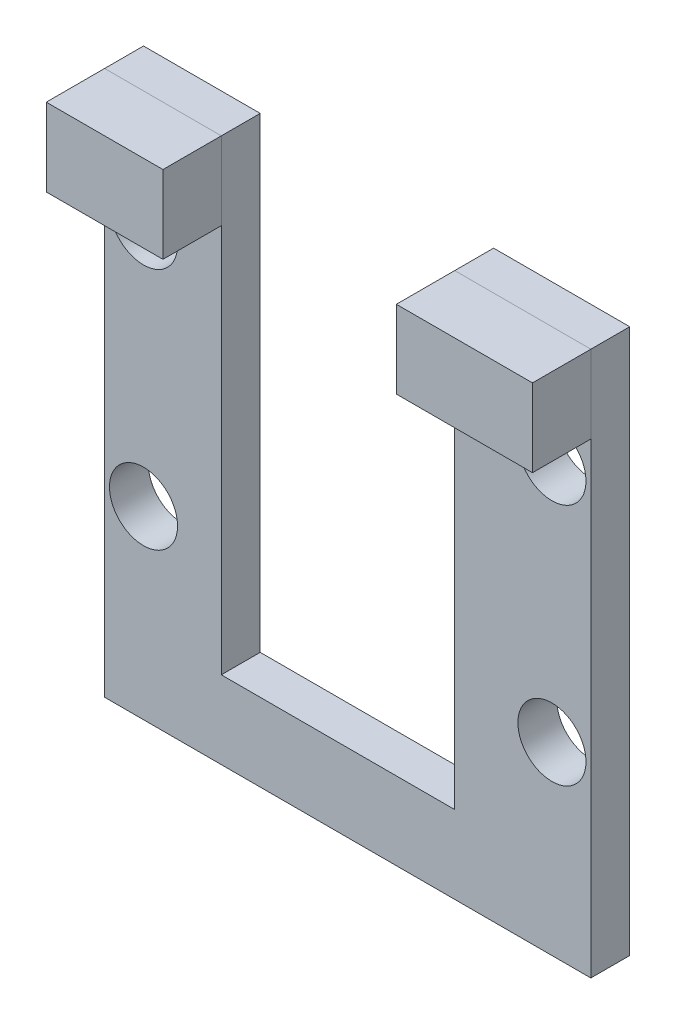
ISO-10303-21;
HEADER;
FILE_DESCRIPTION(('STEP AP214'),'2;1');
FILE_NAME('part.step','',(''),(''),'','','');
FILE_SCHEMA(('AUTOMOTIVE_DESIGN { 1 0 10303 214 1 1 1 1 }'));
ENDSEC;
DATA;
#1=APPLICATION_CONTEXT('core data for automotive mechanical design processes');
#2=APPLICATION_PROTOCOL_DEFINITION('international standard','automotive_design',2000,#1);
#3=PRODUCT_CONTEXT('',#1,'mechanical');
#4=PRODUCT('Part','Part','',(#3));
#5=PRODUCT_RELATED_PRODUCT_CATEGORY('part','',(#4));
#6=PRODUCT_DEFINITION_FORMATION('','',#4);
#7=PRODUCT_DEFINITION_CONTEXT('part definition',#1,'design');
#8=PRODUCT_DEFINITION('design','',#6,#7);
#9=PRODUCT_DEFINITION_SHAPE('','',#8);
#10=(LENGTH_UNIT() NAMED_UNIT(*) SI_UNIT(.MILLI.,.METRE.));
#11=(NAMED_UNIT(*) PLANE_ANGLE_UNIT() SI_UNIT($,.RADIAN.));
#12=(NAMED_UNIT(*) SI_UNIT($,.STERADIAN.) SOLID_ANGLE_UNIT());
#13=UNCERTAINTY_MEASURE_WITH_UNIT(LENGTH_MEASURE(1.E-05),#10,'distance_accuracy_value','');
#14=(GEOMETRIC_REPRESENTATION_CONTEXT(3) GLOBAL_UNCERTAINTY_ASSIGNED_CONTEXT((#13)) GLOBAL_UNIT_ASSIGNED_CONTEXT((#10,
#11,#12)) REPRESENTATION_CONTEXT('',''));
#15=CARTESIAN_POINT('',(0.,0.,0.));
#16=DIRECTION('',(0.,0.,1.));
#17=DIRECTION('',(1.,0.,0.));
#18=AXIS2_PLACEMENT_3D('',#15,#16,#17);
#19=CARTESIAN_POINT('',(-19.1048228841698,16.1443272647558,33.));
#20=DIRECTION('',(1.,0.,0.));
#21=DIRECTION('',(0.,0.,-1.));
#22=AXIS2_PLACEMENT_3D('',#19,#20,#21);
#23=PLANE('',#22);
#24=DIRECTION('',(0.,-1.,0.));
#25=VECTOR('',#24,1.);
#26=CARTESIAN_POINT('',(-19.1048228841698,16.1443272647558,30.));
#27=LINE('',#26,#25);
#28=CARTESIAN_POINT('',(-19.1048228841698,20.1443272647558,30.));
#29=VERTEX_POINT('',#28);
#30=CARTESIAN_POINT('',(-19.1048228841698,16.1443272647558,30.));
#31=VERTEX_POINT('',#30);
#32=EDGE_CURVE('P0_E79',#29,#31,#27,.T.);
#33=ORIENTED_EDGE('',*,*,#32,.T.);
#34=DIRECTION('',(0.,0.,-1.));
#35=VECTOR('',#34,1.);
#36=CARTESIAN_POINT('',(-19.1048228841698,16.1443272647558,33.));
#37=LINE('',#36,#35);
#38=CARTESIAN_POINT('',(-19.1048228841698,16.1443272647558,33.));
#39=VERTEX_POINT('',#38);
#40=EDGE_CURVE('P0_E10',#39,#31,#37,.T.);
#41=ORIENTED_EDGE('',*,*,#40,.F.);
#42=DIRECTION('',(0.,-1.,0.));
#43=VECTOR('',#42,1.);
#44=CARTESIAN_POINT('',(-19.1048228841698,16.1443272647558,33.));
#45=LINE('',#44,#43);
#46=CARTESIAN_POINT('',(-19.1048228841698,20.1443272647558,33.));
#47=VERTEX_POINT('',#46);
#48=EDGE_CURVE('P0_E67',#47,#39,#45,.T.);
#49=ORIENTED_EDGE('',*,*,#48,.F.);
#50=DIRECTION('',(0.,0.,-1.));
#51=VECTOR('',#50,1.);
#52=CARTESIAN_POINT('',(-19.1048228841698,20.1443272647558,33.));
#53=LINE('',#52,#51);
#54=EDGE_CURVE('P0_E75',#47,#29,#53,.T.);
#55=ORIENTED_EDGE('',*,*,#54,.T.);
#56=EDGE_LOOP('',(#33,#41,#49,#55));
#57=FACE_BOUND('',#56,.T.);
#58=ADVANCED_FACE('P0_F16',(#57),#23,.F.);
#59=CARTESIAN_POINT('',(-19.1048228841698,16.1443272647558,33.));
#60=DIRECTION('',(0.,1.,0.));
#61=DIRECTION('',(0.,0.,1.));
#62=AXIS2_PLACEMENT_3D('',#59,#60,#61);
#63=PLANE('',#62);
#64=DIRECTION('',(1.,0.,0.));
#65=VECTOR('',#64,1.);
#66=CARTESIAN_POINT('',(-19.1048228841698,16.1443272647558,30.));
#67=LINE('',#66,#65);
#68=CARTESIAN_POINT('',(-13.1048228841698,16.1443272647558,30.));
#69=VERTEX_POINT('',#68);
#70=EDGE_CURVE('P0_E71',#31,#69,#67,.T.);
#71=ORIENTED_EDGE('',*,*,#70,.T.);
#72=DIRECTION('',(0.,0.,-1.));
#73=VECTOR('',#72,1.);
#74=CARTESIAN_POINT('',(-13.1048228841698,16.1443272647558,33.));
#75=LINE('',#74,#73);
#76=CARTESIAN_POINT('',(-13.1048228841698,16.1443272647558,33.));
#77=VERTEX_POINT('',#76);
#78=EDGE_CURVE('P0_E24',#77,#69,#75,.T.);
#79=ORIENTED_EDGE('',*,*,#78,.F.);
#80=DIRECTION('',(1.,0.,0.));
#81=VECTOR('',#80,1.);
#82=CARTESIAN_POINT('',(-19.1048228841698,16.1443272647558,33.));
#83=LINE('',#82,#81);
#84=EDGE_CURVE('P0_E62',#39,#77,#83,.T.);
#85=ORIENTED_EDGE('',*,*,#84,.F.);
#86=ORIENTED_EDGE('',*,*,#40,.T.);
#87=EDGE_LOOP('',(#71,#79,#85,#86));
#88=FACE_BOUND('',#87,.T.);
#89=ADVANCED_FACE('P0_F70',(#88),#63,.F.);
#90=CARTESIAN_POINT('',(-13.1048228841698,16.1443272647558,33.));
#91=DIRECTION('',(-1.,0.,0.));
#92=DIRECTION('',(0.,0.,1.));
#93=AXIS2_PLACEMENT_3D('',#90,#91,#92);
#94=PLANE('',#93);
#95=DIRECTION('',(0.,1.,0.));
#96=VECTOR('',#95,1.);
#97=CARTESIAN_POINT('',(-13.1048228841698,16.1443272647558,30.));
#98=LINE('',#97,#96);
#99=CARTESIAN_POINT('',(-13.1048228841698,20.1443272647558,30.));
#100=VERTEX_POINT('',#99);
#101=EDGE_CURVE('P0_E49',#69,#100,#98,.T.);
#102=ORIENTED_EDGE('',*,*,#101,.T.);
#103=DIRECTION('',(0.,0.,-1.));
#104=VECTOR('',#103,1.);
#105=CARTESIAN_POINT('',(-13.1048228841698,20.1443272647558,33.));
#106=LINE('',#105,#104);
#107=CARTESIAN_POINT('',(-13.1048228841698,20.1443272647558,33.));
#108=VERTEX_POINT('',#107);
#109=EDGE_CURVE('P0_E72',#108,#100,#106,.T.);
#110=ORIENTED_EDGE('',*,*,#109,.F.);
#111=DIRECTION('',(0.,1.,0.));
#112=VECTOR('',#111,1.);
#113=CARTESIAN_POINT('',(-13.1048228841698,16.1443272647558,33.));
#114=LINE('',#113,#112);
#115=EDGE_CURVE('P0_E65',#77,#108,#114,.T.);
#116=ORIENTED_EDGE('',*,*,#115,.F.);
#117=ORIENTED_EDGE('',*,*,#78,.T.);
#118=EDGE_LOOP('',(#102,#110,#116,#117));
#119=FACE_BOUND('',#118,.T.);
#120=ADVANCED_FACE('P0_F73',(#119),#94,.F.);
#121=CARTESIAN_POINT('',(-19.1048228841698,20.1443272647558,33.));
#122=DIRECTION('',(0.,-1.,0.));
#123=DIRECTION('',(0.,0.,-1.));
#124=AXIS2_PLACEMENT_3D('',#121,#122,#123);
#125=PLANE('',#124);
#126=DIRECTION('',(-1.,0.,0.));
#127=VECTOR('',#126,1.);
#128=CARTESIAN_POINT('',(-19.1048228841698,20.1443272647558,30.));
#129=LINE('',#128,#127);
#130=EDGE_CURVE('P0_E55',#100,#29,#129,.T.);
#131=ORIENTED_EDGE('',*,*,#130,.T.);
#132=ORIENTED_EDGE('',*,*,#54,.F.);
#133=DIRECTION('',(-1.,0.,0.));
#134=VECTOR('',#133,1.);
#135=CARTESIAN_POINT('',(-19.1048228841698,20.1443272647558,33.));
#136=LINE('',#135,#134);
#137=EDGE_CURVE('P0_E32',#108,#47,#136,.T.);
#138=ORIENTED_EDGE('',*,*,#137,.F.);
#139=ORIENTED_EDGE('',*,*,#109,.T.);
#140=EDGE_LOOP('',(#131,#132,#138,#139));
#141=FACE_BOUND('',#140,.T.);
#142=ADVANCED_FACE('P0_F86',(#141),#125,.F.);
#143=CARTESIAN_POINT('',(-19.1048228841698,16.1443272647558,33.));
#144=DIRECTION('',(0.,0.,-1.));
#145=DIRECTION('',(-1.,0.,0.));
#146=AXIS2_PLACEMENT_3D('',#143,#144,#145);
#147=PLANE('',#146);
#148=ORIENTED_EDGE('',*,*,#48,.T.);
#149=ORIENTED_EDGE('',*,*,#84,.T.);
#150=ORIENTED_EDGE('',*,*,#115,.T.);
#151=ORIENTED_EDGE('',*,*,#137,.T.);
#152=EDGE_LOOP('',(#148,#149,#150,#151));
#153=FACE_BOUND('',#152,.T.);
#154=ADVANCED_FACE('P0_F63',(#153),#147,.F.);
#155=CARTESIAN_POINT('',(-19.1048228841698,16.1443272647558,30.));
#156=DIRECTION('',(0.,0.,-1.));
#157=DIRECTION('',(-1.,0.,0.));
#158=AXIS2_PLACEMENT_3D('',#155,#156,#157);
#159=PLANE('',#158);
#160=ORIENTED_EDGE('',*,*,#32,.F.);
#161=ORIENTED_EDGE('',*,*,#130,.F.);
#162=ORIENTED_EDGE('',*,*,#101,.F.);
#163=ORIENTED_EDGE('',*,*,#70,.F.);
#164=EDGE_LOOP('',(#160,#161,#162,#163));
#165=FACE_BOUND('',#164,.T.);
#166=ADVANCED_FACE('P0_F89',(#165),#159,.T.);
#167=CLOSED_SHELL('',(#58,#89,#120,#142,#154,#166));
#168=MANIFOLD_SOLID_BREP('P0_B1',#167);
#169=CARTESIAN_POINT('',(-1.10482288416981,16.1443272647558,33.));
#170=DIRECTION('',(1.,0.,0.));
#171=DIRECTION('',(0.,0.,-1.));
#172=AXIS2_PLACEMENT_3D('',#169,#170,#171);
#173=PLANE('',#172);
#174=DIRECTION('',(0.,-1.,0.));
#175=VECTOR('',#174,1.);
#176=CARTESIAN_POINT('',(-1.10482288416981,16.1443272647558,30.));
#177=LINE('',#176,#175);
#178=CARTESIAN_POINT('',(-1.10482288416981,20.1443272647558,30.));
#179=VERTEX_POINT('',#178);
#180=CARTESIAN_POINT('',(-1.10482288416981,16.1443272647558,30.));
#181=VERTEX_POINT('',#180);
#182=EDGE_CURVE('P1_E80',#179,#181,#177,.T.);
#183=ORIENTED_EDGE('',*,*,#182,.T.);
#184=DIRECTION('',(0.,0.,-1.));
#185=VECTOR('',#184,1.);
#186=CARTESIAN_POINT('',(-1.10482288416981,16.1443272647558,33.));
#187=LINE('',#186,#185);
#188=CARTESIAN_POINT('',(-1.10482288416981,16.1443272647558,33.));
#189=VERTEX_POINT('',#188);
#190=EDGE_CURVE('P1_E11',#189,#181,#187,.T.);
#191=ORIENTED_EDGE('',*,*,#190,.F.);
#192=DIRECTION('',(0.,-1.,0.));
#193=VECTOR('',#192,1.);
#194=CARTESIAN_POINT('',(-1.10482288416981,16.1443272647558,33.));
#195=LINE('',#194,#193);
#196=CARTESIAN_POINT('',(-1.10482288416981,20.1443272647558,33.));
#197=VERTEX_POINT('',#196);
#198=EDGE_CURVE('P1_E68',#197,#189,#195,.T.);
#199=ORIENTED_EDGE('',*,*,#198,.F.);
#200=DIRECTION('',(0.,0.,-1.));
#201=VECTOR('',#200,1.);
#202=CARTESIAN_POINT('',(-1.10482288416981,20.1443272647558,33.));
#203=LINE('',#202,#201);
#204=EDGE_CURVE('P1_E76',#197,#179,#203,.T.);
#205=ORIENTED_EDGE('',*,*,#204,.T.);
#206=EDGE_LOOP('',(#183,#191,#199,#205));
#207=FACE_BOUND('',#206,.T.);
#208=ADVANCED_FACE('P1_F17',(#207),#173,.F.);
#209=CARTESIAN_POINT('',(-1.10482288416981,16.1443272647558,33.));
#210=DIRECTION('',(0.,1.,0.));
#211=DIRECTION('',(0.,0.,1.));
#212=AXIS2_PLACEMENT_3D('',#209,#210,#211);
#213=PLANE('',#212);
#214=DIRECTION('',(1.,0.,0.));
#215=VECTOR('',#214,1.);
#216=CARTESIAN_POINT('',(-1.10482288416981,16.1443272647558,30.));
#217=LINE('',#216,#215);
#218=CARTESIAN_POINT('',(5.89517711583019,16.1443272647558,30.));
#219=VERTEX_POINT('',#218);
#220=EDGE_CURVE('P1_E72',#181,#219,#217,.T.);
#221=ORIENTED_EDGE('',*,*,#220,.T.);
#222=DIRECTION('',(0.,0.,-1.));
#223=VECTOR('',#222,1.);
#224=CARTESIAN_POINT('',(5.89517711583019,16.1443272647558,33.));
#225=LINE('',#224,#223);
#226=CARTESIAN_POINT('',(5.89517711583019,16.1443272647558,33.));
#227=VERTEX_POINT('',#226);
#228=EDGE_CURVE('P1_E25',#227,#219,#225,.T.);
#229=ORIENTED_EDGE('',*,*,#228,.F.);
#230=DIRECTION('',(1.,0.,0.));
#231=VECTOR('',#230,1.);
#232=CARTESIAN_POINT('',(-1.10482288416981,16.1443272647558,33.));
#233=LINE('',#232,#231);
#234=EDGE_CURVE('P1_E63',#189,#227,#233,.T.);
#235=ORIENTED_EDGE('',*,*,#234,.F.);
#236=ORIENTED_EDGE('',*,*,#190,.T.);
#237=EDGE_LOOP('',(#221,#229,#235,#236));
#238=FACE_BOUND('',#237,.T.);
#239=ADVANCED_FACE('P1_F71',(#238),#213,.F.);
#240=CARTESIAN_POINT('',(5.89517711583019,16.1443272647558,33.));
#241=DIRECTION('',(-1.,0.,0.));
#242=DIRECTION('',(0.,0.,1.));
#243=AXIS2_PLACEMENT_3D('',#240,#241,#242);
#244=PLANE('',#243);
#245=DIRECTION('',(0.,1.,0.));
#246=VECTOR('',#245,1.);
#247=CARTESIAN_POINT('',(5.89517711583019,16.1443272647558,30.));
#248=LINE('',#247,#246);
#249=CARTESIAN_POINT('',(5.89517711583019,20.1443272647558,30.));
#250=VERTEX_POINT('',#249);
#251=EDGE_CURVE('P1_E50',#219,#250,#248,.T.);
#252=ORIENTED_EDGE('',*,*,#251,.T.);
#253=DIRECTION('',(0.,0.,-1.));
#254=VECTOR('',#253,1.);
#255=CARTESIAN_POINT('',(5.89517711583019,20.1443272647558,33.));
#256=LINE('',#255,#254);
#257=CARTESIAN_POINT('',(5.89517711583019,20.1443272647558,33.));
#258=VERTEX_POINT('',#257);
#259=EDGE_CURVE('P1_E73',#258,#250,#256,.T.);
#260=ORIENTED_EDGE('',*,*,#259,.F.);
#261=DIRECTION('',(0.,1.,0.));
#262=VECTOR('',#261,1.);
#263=CARTESIAN_POINT('',(5.89517711583019,16.1443272647558,33.));
#264=LINE('',#263,#262);
#265=EDGE_CURVE('P1_E66',#227,#258,#264,.T.);
#266=ORIENTED_EDGE('',*,*,#265,.F.);
#267=ORIENTED_EDGE('',*,*,#228,.T.);
#268=EDGE_LOOP('',(#252,#260,#266,#267));
#269=FACE_BOUND('',#268,.T.);
#270=ADVANCED_FACE('P1_F74',(#269),#244,.F.);
#271=CARTESIAN_POINT('',(-1.10482288416981,20.1443272647558,33.));
#272=DIRECTION('',(0.,-1.,0.));
#273=DIRECTION('',(0.,0.,-1.));
#274=AXIS2_PLACEMENT_3D('',#271,#272,#273);
#275=PLANE('',#274);
#276=DIRECTION('',(-1.,0.,0.));
#277=VECTOR('',#276,1.);
#278=CARTESIAN_POINT('',(-1.10482288416981,20.1443272647558,30.));
#279=LINE('',#278,#277);
#280=EDGE_CURVE('P1_E56',#250,#179,#279,.T.);
#281=ORIENTED_EDGE('',*,*,#280,.T.);
#282=ORIENTED_EDGE('',*,*,#204,.F.);
#283=DIRECTION('',(-1.,0.,0.));
#284=VECTOR('',#283,1.);
#285=CARTESIAN_POINT('',(-1.10482288416981,20.1443272647558,33.));
#286=LINE('',#285,#284);
#287=EDGE_CURVE('P1_E33',#258,#197,#286,.T.);
#288=ORIENTED_EDGE('',*,*,#287,.F.);
#289=ORIENTED_EDGE('',*,*,#259,.T.);
#290=EDGE_LOOP('',(#281,#282,#288,#289));
#291=FACE_BOUND('',#290,.T.);
#292=ADVANCED_FACE('P1_F87',(#291),#275,.F.);
#293=CARTESIAN_POINT('',(-1.10482288416981,16.1443272647558,33.));
#294=DIRECTION('',(0.,0.,-1.));
#295=DIRECTION('',(-1.,0.,0.));
#296=AXIS2_PLACEMENT_3D('',#293,#294,#295);
#297=PLANE('',#296);
#298=ORIENTED_EDGE('',*,*,#198,.T.);
#299=ORIENTED_EDGE('',*,*,#234,.T.);
#300=ORIENTED_EDGE('',*,*,#265,.T.);
#301=ORIENTED_EDGE('',*,*,#287,.T.);
#302=EDGE_LOOP('',(#298,#299,#300,#301));
#303=FACE_BOUND('',#302,.T.);
#304=ADVANCED_FACE('P1_F64',(#303),#297,.F.);
#305=CARTESIAN_POINT('',(-1.10482288416981,16.1443272647558,30.));
#306=DIRECTION('',(0.,0.,-1.));
#307=DIRECTION('',(-1.,0.,0.));
#308=AXIS2_PLACEMENT_3D('',#305,#306,#307);
#309=PLANE('',#308);
#310=ORIENTED_EDGE('',*,*,#182,.F.);
#311=ORIENTED_EDGE('',*,*,#280,.F.);
#312=ORIENTED_EDGE('',*,*,#251,.F.);
#313=ORIENTED_EDGE('',*,*,#220,.F.);
#314=EDGE_LOOP('',(#310,#311,#312,#313));
#315=FACE_BOUND('',#314,.T.);
#316=ADVANCED_FACE('P1_F90',(#315),#309,.T.);
#317=CLOSED_SHELL('',(#208,#239,#270,#292,#304,#316));
#318=MANIFOLD_SOLID_BREP('P1_B1',#317);
#319=CARTESIAN_POINT('',(5.8951771158302,-7.85567273524422,30.));
#320=DIRECTION('',(-1.,0.,0.));
#321=DIRECTION('',(0.,-1.,0.));
#322=AXIS2_PLACEMENT_3D('',#319,#320,#321);
#323=PLANE('',#322);
#324=DIRECTION('',(0.,1.,0.));
#325=VECTOR('',#324,1.);
#326=CARTESIAN_POINT('',(5.8951771158302,-7.85567273524422,28.));
#327=LINE('',#326,#325);
#328=CARTESIAN_POINT('',(5.8951771158302,-7.85567273524423,28.));
#329=VERTEX_POINT('',#328);
#330=CARTESIAN_POINT('',(5.8951771158302,20.1443272647558,28.));
#331=VERTEX_POINT('',#330);
#332=EDGE_CURVE('P2_E124',#329,#331,#327,.T.);
#333=ORIENTED_EDGE('',*,*,#332,.T.);
#334=DIRECTION('',(0.,0.,-1.));
#335=VECTOR('',#334,1.);
#336=CARTESIAN_POINT('',(5.8951771158302,20.1443272647558,30.));
#337=LINE('',#336,#335);
#338=CARTESIAN_POINT('',(5.8951771158302,20.1443272647558,30.));
#339=VERTEX_POINT('',#338);
#340=EDGE_CURVE('P2_E11',#339,#331,#337,.T.);
#341=ORIENTED_EDGE('',*,*,#340,.F.);
#342=DIRECTION('',(0.,1.,0.));
#343=VECTOR('',#342,1.);
#344=CARTESIAN_POINT('',(5.8951771158302,-7.85567273524422,30.));
#345=LINE('',#344,#343);
#346=CARTESIAN_POINT('',(5.8951771158302,-7.85567273524423,30.));
#347=VERTEX_POINT('',#346);
#348=EDGE_CURVE('P2_E70',#347,#339,#345,.T.);
#349=ORIENTED_EDGE('',*,*,#348,.F.);
#350=DIRECTION('',(0.,0.,-1.));
#351=VECTOR('',#350,1.);
#352=CARTESIAN_POINT('',(5.8951771158302,-7.85567273524423,30.));
#353=LINE('',#352,#351);
#354=EDGE_CURVE('P2_E108',#347,#329,#353,.T.);
#355=ORIENTED_EDGE('',*,*,#354,.T.);
#356=EDGE_LOOP('',(#333,#341,#349,#355));
#357=FACE_BOUND('',#356,.T.);
#358=ADVANCED_FACE('P2_F17',(#357),#323,.F.);
#359=CARTESIAN_POINT('',(-19.1048228841698,20.1443272647558,30.));
#360=DIRECTION('',(0.,1.,0.));
#361=DIRECTION('',(0.,0.,1.));
#362=AXIS2_PLACEMENT_3D('',#359,#360,#361);
#363=PLANE('',#362);
#364=DIRECTION('',(1.,0.,0.));
#365=VECTOR('',#364,1.);
#366=CARTESIAN_POINT('',(-19.1048228841698,20.1443272647558,28.));
#367=LINE('',#366,#365);
#368=CARTESIAN_POINT('',(-1.1048228841698,20.1443272647558,28.));
#369=VERTEX_POINT('',#368);
#370=EDGE_CURVE('P2_E127',#369,#331,#367,.T.);
#371=ORIENTED_EDGE('',*,*,#370,.F.);
#372=DIRECTION('',(0.,0.,-1.));
#373=VECTOR('',#372,1.);
#374=CARTESIAN_POINT('',(-1.1048228841698,20.1443272647558,30.));
#375=LINE('',#374,#373);
#376=CARTESIAN_POINT('',(-1.1048228841698,20.1443272647558,30.));
#377=VERTEX_POINT('',#376);
#378=EDGE_CURVE('P2_E26',#377,#369,#375,.T.);
#379=ORIENTED_EDGE('',*,*,#378,.F.);
#380=DIRECTION('',(1.,0.,0.));
#381=VECTOR('',#380,1.);
#382=CARTESIAN_POINT('',(-19.1048228841698,20.1443272647558,30.));
#383=LINE('',#382,#381);
#384=EDGE_CURVE('P2_E169',#377,#339,#383,.T.);
#385=ORIENTED_EDGE('',*,*,#384,.T.);
#386=ORIENTED_EDGE('',*,*,#340,.T.);
#387=EDGE_LOOP('',(#371,#379,#385,#386));
#388=FACE_BOUND('',#387,.T.);
#389=ADVANCED_FACE('P2_F159',(#388),#363,.T.);
#390=CARTESIAN_POINT('',(-1.1048228841698,-7.85567273524423,30.));
#391=DIRECTION('',(-1.,0.,0.));
#392=DIRECTION('',(0.,0.,1.));
#393=AXIS2_PLACEMENT_3D('',#390,#391,#392);
#394=PLANE('',#393);
#395=DIRECTION('',(0.,1.,0.));
#396=VECTOR('',#395,1.);
#397=CARTESIAN_POINT('',(-1.1048228841698,-7.85567273524423,28.));
#398=LINE('',#397,#396);
#399=CARTESIAN_POINT('',(-1.1048228841698,-3.85567273524423,28.));
#400=VERTEX_POINT('',#399);
#401=EDGE_CURVE('P2_E130',#400,#369,#398,.T.);
#402=ORIENTED_EDGE('',*,*,#401,.F.);
#403=DIRECTION('',(0.,0.,-1.));
#404=VECTOR('',#403,1.);
#405=CARTESIAN_POINT('',(-1.1048228841698,-3.85567273524423,30.));
#406=LINE('',#405,#404);
#407=CARTESIAN_POINT('',(-1.1048228841698,-3.85567273524423,30.));
#408=VERTEX_POINT('',#407);
#409=EDGE_CURVE('P2_E149',#408,#400,#406,.T.);
#410=ORIENTED_EDGE('',*,*,#409,.F.);
#411=DIRECTION('',(0.,1.,0.));
#412=VECTOR('',#411,1.);
#413=CARTESIAN_POINT('',(-1.1048228841698,-7.85567273524423,30.));
#414=LINE('',#413,#412);
#415=EDGE_CURVE('P2_E156',#408,#377,#414,.T.);
#416=ORIENTED_EDGE('',*,*,#415,.T.);
#417=ORIENTED_EDGE('',*,*,#378,.T.);
#418=EDGE_LOOP('',(#402,#410,#416,#417));
#419=FACE_BOUND('',#418,.T.);
#420=ADVANCED_FACE('P2_F154',(#419),#394,.T.);
#421=CARTESIAN_POINT('',(-19.1048228841698,-3.85567273524423,30.));
#422=DIRECTION('',(0.,1.,0.));
#423=DIRECTION('',(0.,0.,1.));
#424=AXIS2_PLACEMENT_3D('',#421,#422,#423);
#425=PLANE('',#424);
#426=DIRECTION('',(1.,0.,0.));
#427=VECTOR('',#426,1.);
#428=CARTESIAN_POINT('',(-19.1048228841698,-3.85567273524423,28.));
#429=LINE('',#428,#427);
#430=CARTESIAN_POINT('',(-13.1048228841698,-3.85567273524423,28.));
#431=VERTEX_POINT('',#430);
#432=EDGE_CURVE('P2_E133',#431,#400,#429,.T.);
#433=ORIENTED_EDGE('',*,*,#432,.F.);
#434=DIRECTION('',(0.,0.,-1.));
#435=VECTOR('',#434,1.);
#436=CARTESIAN_POINT('',(-13.1048228841698,-3.85567273524423,30.));
#437=LINE('',#436,#435);
#438=CARTESIAN_POINT('',(-13.1048228841698,-3.85567273524423,30.));
#439=VERTEX_POINT('',#438);
#440=EDGE_CURVE('P2_E147',#439,#431,#437,.T.);
#441=ORIENTED_EDGE('',*,*,#440,.F.);
#442=DIRECTION('',(1.,0.,0.));
#443=VECTOR('',#442,1.);
#444=CARTESIAN_POINT('',(-19.1048228841698,-3.85567273524423,30.));
#445=LINE('',#444,#443);
#446=EDGE_CURVE('P2_E168',#439,#408,#445,.T.);
#447=ORIENTED_EDGE('',*,*,#446,.T.);
#448=ORIENTED_EDGE('',*,*,#409,.T.);
#449=EDGE_LOOP('',(#433,#441,#447,#448));
#450=FACE_BOUND('',#449,.T.);
#451=ADVANCED_FACE('P2_F166',(#450),#425,.T.);
#452=CARTESIAN_POINT('',(-13.1048228841698,-7.85567273524423,30.));
#453=DIRECTION('',(-1.,0.,0.));
#454=DIRECTION('',(0.,0.,1.));
#455=AXIS2_PLACEMENT_3D('',#452,#453,#454);
#456=PLANE('',#455);
#457=DIRECTION('',(0.,1.,0.));
#458=VECTOR('',#457,1.);
#459=CARTESIAN_POINT('',(-13.1048228841698,-7.85567273524423,28.));
#460=LINE('',#459,#458);
#461=CARTESIAN_POINT('',(-13.1048228841698,20.1443272647558,28.));
#462=VERTEX_POINT('',#461);
#463=EDGE_CURVE('P2_E136',#431,#462,#460,.T.);
#464=ORIENTED_EDGE('',*,*,#463,.T.);
#465=DIRECTION('',(0.,0.,-1.));
#466=VECTOR('',#465,1.);
#467=CARTESIAN_POINT('',(-13.1048228841698,20.1443272647558,30.));
#468=LINE('',#467,#466);
#469=CARTESIAN_POINT('',(-13.1048228841698,20.1443272647558,30.));
#470=VERTEX_POINT('',#469);
#471=EDGE_CURVE('P2_E97',#470,#462,#468,.T.);
#472=ORIENTED_EDGE('',*,*,#471,.F.);
#473=DIRECTION('',(0.,1.,0.));
#474=VECTOR('',#473,1.);
#475=CARTESIAN_POINT('',(-13.1048228841698,-7.85567273524423,30.));
#476=LINE('',#475,#474);
#477=EDGE_CURVE('P2_E103',#439,#470,#476,.T.);
#478=ORIENTED_EDGE('',*,*,#477,.F.);
#479=ORIENTED_EDGE('',*,*,#440,.T.);
#480=EDGE_LOOP('',(#464,#472,#478,#479));
#481=FACE_BOUND('',#480,.T.);
#482=ADVANCED_FACE('P2_F246',(#481),#456,.F.);
#483=CARTESIAN_POINT('',(-19.1048228841698,20.1443272647558,30.));
#484=DIRECTION('',(0.,1.,0.));
#485=DIRECTION('',(0.,0.,1.));
#486=AXIS2_PLACEMENT_3D('',#483,#484,#485);
#487=PLANE('',#486);
#488=DIRECTION('',(1.,0.,0.));
#489=VECTOR('',#488,1.);
#490=CARTESIAN_POINT('',(-19.1048228841698,20.1443272647558,28.));
#491=LINE('',#490,#489);
#492=CARTESIAN_POINT('',(-19.1048228841698,20.1443272647558,28.));
#493=VERTEX_POINT('',#492);
#494=EDGE_CURVE('P2_E92',#493,#462,#491,.T.);
#495=ORIENTED_EDGE('',*,*,#494,.F.);
#496=DIRECTION('',(0.,0.,-1.));
#497=VECTOR('',#496,1.);
#498=CARTESIAN_POINT('',(-19.1048228841698,20.1443272647558,30.));
#499=LINE('',#498,#497);
#500=CARTESIAN_POINT('',(-19.1048228841698,20.1443272647558,30.));
#501=VERTEX_POINT('',#500);
#502=EDGE_CURVE('P2_E87',#501,#493,#499,.T.);
#503=ORIENTED_EDGE('',*,*,#502,.F.);
#504=DIRECTION('',(1.,0.,0.));
#505=VECTOR('',#504,1.);
#506=CARTESIAN_POINT('',(-19.1048228841698,20.1443272647558,30.));
#507=LINE('',#506,#505);
#508=EDGE_CURVE('P2_E90',#501,#470,#507,.T.);
#509=ORIENTED_EDGE('',*,*,#508,.T.);
#510=ORIENTED_EDGE('',*,*,#471,.T.);
#511=EDGE_LOOP('',(#495,#503,#509,#510));
#512=FACE_BOUND('',#511,.T.);
#513=ADVANCED_FACE('P2_F89',(#512),#487,.T.);
#514=CARTESIAN_POINT('',(-19.1048228841698,-7.85567273524423,30.));
#515=DIRECTION('',(-1.,0.,0.));
#516=DIRECTION('',(0.,-1.,0.));
#517=AXIS2_PLACEMENT_3D('',#514,#515,#516);
#518=PLANE('',#517);
#519=DIRECTION('',(0.,1.,0.));
#520=VECTOR('',#519,1.);
#521=CARTESIAN_POINT('',(-19.1048228841698,-7.85567273524423,28.));
#522=LINE('',#521,#520);
#523=CARTESIAN_POINT('',(-19.1048228841698,-7.85567273524423,28.));
#524=VERTEX_POINT('',#523);
#525=EDGE_CURVE('P2_E140',#524,#493,#522,.T.);
#526=ORIENTED_EDGE('',*,*,#525,.F.);
#527=DIRECTION('',(0.,0.,-1.));
#528=VECTOR('',#527,1.);
#529=CARTESIAN_POINT('',(-19.1048228841698,-7.85567273524423,30.));
#530=LINE('',#529,#528);
#531=CARTESIAN_POINT('',(-19.1048228841698,-7.85567273524423,30.));
#532=VERTEX_POINT('',#531);
#533=EDGE_CURVE('P2_E61',#532,#524,#530,.T.);
#534=ORIENTED_EDGE('',*,*,#533,.F.);
#535=DIRECTION('',(0.,1.,0.));
#536=VECTOR('',#535,1.);
#537=CARTESIAN_POINT('',(-19.1048228841698,-7.85567273524423,30.));
#538=LINE('',#537,#536);
#539=EDGE_CURVE('P2_E100',#532,#501,#538,.T.);
#540=ORIENTED_EDGE('',*,*,#539,.T.);
#541=ORIENTED_EDGE('',*,*,#502,.T.);
#542=EDGE_LOOP('',(#526,#534,#540,#541));
#543=FACE_BOUND('',#542,.T.);
#544=ADVANCED_FACE('P2_F106',(#543),#518,.T.);
#545=CARTESIAN_POINT('',(-17.1048228841698,14.1443272647558,30.));
#546=DIRECTION('',(0.,0.,-1.));
#547=DIRECTION('',(-1.,0.,0.));
#548=AXIS2_PLACEMENT_3D('',#545,#546,#547);
#549=CYLINDRICAL_SURFACE('',#548,1.75);
#550=CARTESIAN_POINT('',(-17.1048228841698,14.1443272647558,30.));
#551=DIRECTION('',(0.,0.,1.));
#552=DIRECTION('',(1.,0.,0.));
#553=AXIS2_PLACEMENT_3D('',#550,#551,#552);
#554=CIRCLE('',#553,1.75);
#555=CARTESIAN_POINT('',(-15.3548228841698,14.1443272647558,30.));
#556=VERTEX_POINT('',#555);
#557=EDGE_CURVE('P2_E175',#556,#556,#554,.T.);
#558=ORIENTED_EDGE('',*,*,#557,.T.);
#559=EDGE_LOOP('',(#558));
#560=FACE_BOUND('',#559,.T.);
#561=CARTESIAN_POINT('',(-17.1048228841698,14.1443272647558,28.));
#562=DIRECTION('',(0.,0.,1.));
#563=DIRECTION('',(1.,0.,0.));
#564=AXIS2_PLACEMENT_3D('',#561,#562,#563);
#565=CIRCLE('',#564,1.75);
#566=CARTESIAN_POINT('',(-15.3548228841698,14.1443272647558,28.));
#567=VERTEX_POINT('',#566);
#568=EDGE_CURVE('P2_E121',#567,#567,#565,.T.);
#569=ORIENTED_EDGE('',*,*,#568,.F.);
#570=EDGE_LOOP('',(#569));
#571=FACE_BOUND('',#570,.T.);
#572=ADVANCED_FACE('P2_F199',(#560,#571),#549,.F.);
#573=CARTESIAN_POINT('',(3.8951771158302,14.1443272647558,30.));
#574=DIRECTION('',(0.,0.,-1.));
#575=DIRECTION('',(-1.,0.,0.));
#576=AXIS2_PLACEMENT_3D('',#573,#574,#575);
#577=CYLINDRICAL_SURFACE('',#576,1.75);
#578=CARTESIAN_POINT('',(3.8951771158302,14.1443272647558,30.));
#579=DIRECTION('',(0.,0.,1.));
#580=DIRECTION('',(1.,0.,0.));
#581=AXIS2_PLACEMENT_3D('',#578,#579,#580);
#582=CIRCLE('',#581,1.75);
#583=CARTESIAN_POINT('',(5.6451771158302,14.1443272647558,30.));
#584=VERTEX_POINT('',#583);
#585=EDGE_CURVE('P2_E178',#584,#584,#582,.T.);
#586=ORIENTED_EDGE('',*,*,#585,.T.);
#587=EDGE_LOOP('',(#586));
#588=FACE_BOUND('',#587,.T.);
#589=CARTESIAN_POINT('',(3.8951771158302,14.1443272647558,28.));
#590=DIRECTION('',(0.,0.,1.));
#591=DIRECTION('',(1.,0.,0.));
#592=AXIS2_PLACEMENT_3D('',#589,#590,#591);
#593=CIRCLE('',#592,1.75);
#594=CARTESIAN_POINT('',(5.6451771158302,14.1443272647558,28.));
#595=VERTEX_POINT('',#594);
#596=EDGE_CURVE('P2_E118',#595,#595,#593,.T.);
#597=ORIENTED_EDGE('',*,*,#596,.F.);
#598=EDGE_LOOP('',(#597));
#599=FACE_BOUND('',#598,.T.);
#600=ADVANCED_FACE('P2_F202',(#588,#599),#577,.F.);
#601=CARTESIAN_POINT('',(-17.1048228841698,1.64432726475576,30.));
#602=DIRECTION('',(0.,0.,-1.));
#603=DIRECTION('',(-1.,0.,0.));
#604=AXIS2_PLACEMENT_3D('',#601,#602,#603);
#605=CYLINDRICAL_SURFACE('',#604,1.75);
#606=CARTESIAN_POINT('',(-17.1048228841698,1.64432726475576,30.));
#607=DIRECTION('',(0.,0.,1.));
#608=DIRECTION('',(1.,0.,0.));
#609=AXIS2_PLACEMENT_3D('',#606,#607,#608);
#610=CIRCLE('',#609,1.75);
#611=CARTESIAN_POINT('',(-15.3548228841698,1.64432726475576,30.));
#612=VERTEX_POINT('',#611);
#613=EDGE_CURVE('P2_E181',#612,#612,#610,.T.);
#614=ORIENTED_EDGE('',*,*,#613,.T.);
#615=EDGE_LOOP('',(#614));
#616=FACE_BOUND('',#615,.T.);
#617=CARTESIAN_POINT('',(-17.1048228841698,1.64432726475576,28.));
#618=DIRECTION('',(0.,0.,1.));
#619=DIRECTION('',(1.,0.,0.));
#620=AXIS2_PLACEMENT_3D('',#617,#618,#619);
#621=CIRCLE('',#620,1.75);
#622=CARTESIAN_POINT('',(-15.3548228841698,1.64432726475576,28.));
#623=VERTEX_POINT('',#622);
#624=EDGE_CURVE('P2_E115',#623,#623,#621,.T.);
#625=ORIENTED_EDGE('',*,*,#624,.F.);
#626=EDGE_LOOP('',(#625));
#627=FACE_BOUND('',#626,.T.);
#628=ADVANCED_FACE('P2_F224',(#616,#627),#605,.F.);
#629=CARTESIAN_POINT('',(3.8951771158302,1.64432726475576,30.));
#630=DIRECTION('',(0.,0.,-1.));
#631=DIRECTION('',(-1.,0.,0.));
#632=AXIS2_PLACEMENT_3D('',#629,#630,#631);
#633=CYLINDRICAL_SURFACE('',#632,1.75);
#634=CARTESIAN_POINT('',(3.8951771158302,1.64432726475576,30.));
#635=DIRECTION('',(0.,0.,1.));
#636=DIRECTION('',(1.,0.,0.));
#637=AXIS2_PLACEMENT_3D('',#634,#635,#636);
#638=CIRCLE('',#637,1.75);
#639=CARTESIAN_POINT('',(5.6451771158302,1.64432726475576,30.));
#640=VERTEX_POINT('',#639);
#641=EDGE_CURVE('P2_E143',#640,#640,#638,.T.);
#642=ORIENTED_EDGE('',*,*,#641,.T.);
#643=EDGE_LOOP('',(#642));
#644=FACE_BOUND('',#643,.T.);
#645=CARTESIAN_POINT('',(3.8951771158302,1.64432726475576,28.));
#646=DIRECTION('',(0.,0.,1.));
#647=DIRECTION('',(1.,0.,0.));
#648=AXIS2_PLACEMENT_3D('',#645,#646,#647);
#649=CIRCLE('',#648,1.75);
#650=CARTESIAN_POINT('',(5.6451771158302,1.64432726475576,28.));
#651=VERTEX_POINT('',#650);
#652=EDGE_CURVE('P2_E112',#651,#651,#649,.T.);
#653=ORIENTED_EDGE('',*,*,#652,.F.);
#654=EDGE_LOOP('',(#653));
#655=FACE_BOUND('',#654,.T.);
#656=ADVANCED_FACE('P2_F19',(#644,#655),#633,.F.);
#657=CARTESIAN_POINT('',(-19.1048228841698,-7.85567273524423,30.));
#658=DIRECTION('',(0.,1.,0.));
#659=DIRECTION('',(0.,0.,1.));
#660=AXIS2_PLACEMENT_3D('',#657,#658,#659);
#661=PLANE('',#660);
#662=DIRECTION('',(1.,0.,0.));
#663=VECTOR('',#662,1.);
#664=CARTESIAN_POINT('',(-19.1048228841698,-7.85567273524423,28.));
#665=LINE('',#664,#663);
#666=EDGE_CURVE('P2_E64',#524,#329,#665,.T.);
#667=ORIENTED_EDGE('',*,*,#666,.T.);
#668=ORIENTED_EDGE('',*,*,#354,.F.);
#669=DIRECTION('',(1.,0.,0.));
#670=VECTOR('',#669,1.);
#671=CARTESIAN_POINT('',(-19.1048228841698,-7.85567273524423,30.));
#672=LINE('',#671,#670);
#673=EDGE_CURVE('P2_E34',#532,#347,#672,.T.);
#674=ORIENTED_EDGE('',*,*,#673,.F.);
#675=ORIENTED_EDGE('',*,*,#533,.T.);
#676=EDGE_LOOP('',(#667,#668,#674,#675));
#677=FACE_BOUND('',#676,.T.);
#678=ADVANCED_FACE('P2_F191',(#677),#661,.F.);
#679=CARTESIAN_POINT('',(-19.1048228841698,-7.85567273524423,30.));
#680=DIRECTION('',(0.,0.,1.));
#681=DIRECTION('',(1.,0.,0.));
#682=AXIS2_PLACEMENT_3D('',#679,#680,#681);
#683=PLANE('',#682);
#684=ORIENTED_EDGE('',*,*,#641,.F.);
#685=EDGE_LOOP('',(#684));
#686=FACE_BOUND('',#685,.T.);
#687=ORIENTED_EDGE('',*,*,#613,.F.);
#688=EDGE_LOOP('',(#687));
#689=FACE_BOUND('',#688,.T.);
#690=ORIENTED_EDGE('',*,*,#585,.F.);
#691=EDGE_LOOP('',(#690));
#692=FACE_BOUND('',#691,.T.);
#693=ORIENTED_EDGE('',*,*,#557,.F.);
#694=EDGE_LOOP('',(#693));
#695=FACE_BOUND('',#694,.T.);
#696=ORIENTED_EDGE('',*,*,#348,.T.);
#697=ORIENTED_EDGE('',*,*,#384,.F.);
#698=ORIENTED_EDGE('',*,*,#415,.F.);
#699=ORIENTED_EDGE('',*,*,#446,.F.);
#700=ORIENTED_EDGE('',*,*,#477,.T.);
#701=ORIENTED_EDGE('',*,*,#508,.F.);
#702=ORIENTED_EDGE('',*,*,#539,.F.);
#703=ORIENTED_EDGE('',*,*,#673,.T.);
#704=EDGE_LOOP('',(#696,#697,#698,#699,#700,#701,#702,#703));
#705=FACE_BOUND('',#704,.T.);
#706=ADVANCED_FACE('P2_F99',(#686,#689,#692,#695,#705),#683,.T.);
#707=CARTESIAN_POINT('',(-19.1048228841698,-7.85567273524423,28.));
#708=DIRECTION('',(0.,0.,1.));
#709=DIRECTION('',(1.,0.,0.));
#710=AXIS2_PLACEMENT_3D('',#707,#708,#709);
#711=PLANE('',#710);
#712=ORIENTED_EDGE('',*,*,#652,.T.);
#713=EDGE_LOOP('',(#712));
#714=FACE_BOUND('',#713,.T.);
#715=ORIENTED_EDGE('',*,*,#624,.T.);
#716=EDGE_LOOP('',(#715));
#717=FACE_BOUND('',#716,.T.);
#718=ORIENTED_EDGE('',*,*,#596,.T.);
#719=EDGE_LOOP('',(#718));
#720=FACE_BOUND('',#719,.T.);
#721=ORIENTED_EDGE('',*,*,#568,.T.);
#722=EDGE_LOOP('',(#721));
#723=FACE_BOUND('',#722,.T.);
#724=ORIENTED_EDGE('',*,*,#332,.F.);
#725=ORIENTED_EDGE('',*,*,#666,.F.);
#726=ORIENTED_EDGE('',*,*,#525,.T.);
#727=ORIENTED_EDGE('',*,*,#494,.T.);
#728=ORIENTED_EDGE('',*,*,#463,.F.);
#729=ORIENTED_EDGE('',*,*,#432,.T.);
#730=ORIENTED_EDGE('',*,*,#401,.T.);
#731=ORIENTED_EDGE('',*,*,#370,.T.);
#732=EDGE_LOOP('',(#724,#725,#726,#727,#728,#729,#730,#731));
#733=FACE_BOUND('',#732,.T.);
#734=ADVANCED_FACE('P2_F162',(#714,#717,#720,#723,#733),#711,.F.);
#735=CLOSED_SHELL('',(#358,#389,#420,#451,#482,#513,#544,#572,#600,#628,#656,#678,#706,#734));
#736=MANIFOLD_SOLID_BREP('P2_B1',#735);
#737=ADVANCED_BREP_SHAPE_REPRESENTATION('',(#18,#168,#318,#736),#14);
#738=SHAPE_DEFINITION_REPRESENTATION(#9,#737);
ENDSEC;
END-ISO-10303-21;
